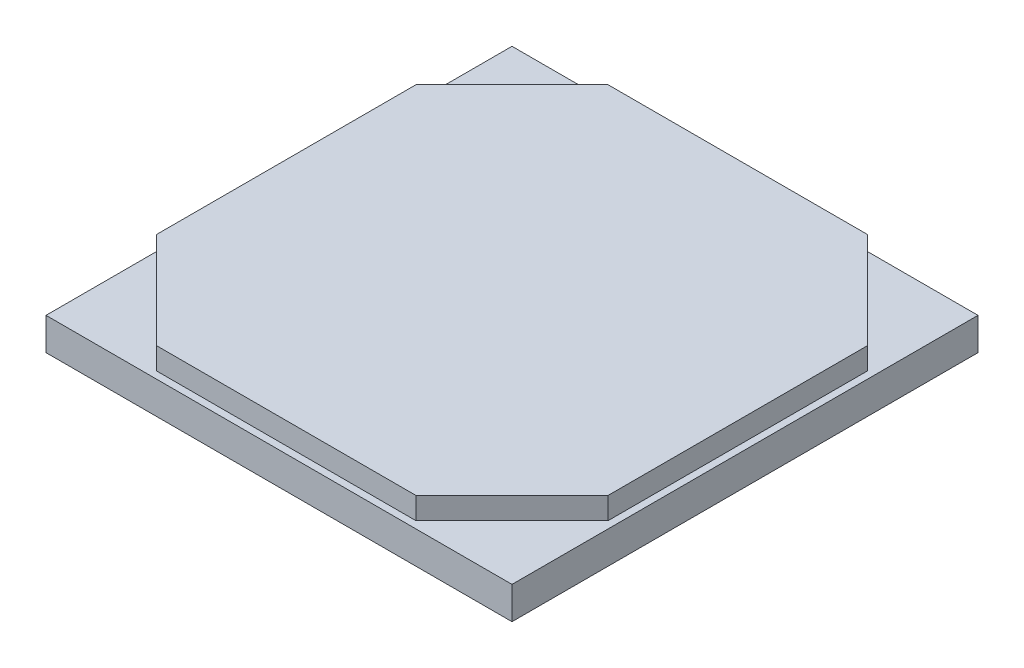
ISO-10303-21;
HEADER;
FILE_DESCRIPTION(('STEP AP214'),'2;1');
FILE_NAME('part.step','',(''),(''),'','','');
FILE_SCHEMA(('AUTOMOTIVE_DESIGN { 1 0 10303 214 1 1 1 1 }'));
ENDSEC;
DATA;
#1=APPLICATION_CONTEXT('core data for automotive mechanical design processes');
#2=APPLICATION_PROTOCOL_DEFINITION('international standard','automotive_design',2000,#1);
#3=PRODUCT_CONTEXT('',#1,'mechanical');
#4=PRODUCT('Part','Part','',(#3));
#5=PRODUCT_RELATED_PRODUCT_CATEGORY('part','',(#4));
#6=PRODUCT_DEFINITION_FORMATION('','',#4);
#7=PRODUCT_DEFINITION_CONTEXT('part definition',#1,'design');
#8=PRODUCT_DEFINITION('design','',#6,#7);
#9=PRODUCT_DEFINITION_SHAPE('','',#8);
#10=(LENGTH_UNIT() NAMED_UNIT(*) SI_UNIT(.MILLI.,.METRE.));
#11=(NAMED_UNIT(*) PLANE_ANGLE_UNIT() SI_UNIT($,.RADIAN.));
#12=(NAMED_UNIT(*) SI_UNIT($,.STERADIAN.) SOLID_ANGLE_UNIT());
#13=UNCERTAINTY_MEASURE_WITH_UNIT(LENGTH_MEASURE(1.E-05),#10,'distance_accuracy_value','');
#14=(GEOMETRIC_REPRESENTATION_CONTEXT(3) GLOBAL_UNCERTAINTY_ASSIGNED_CONTEXT((#13)) GLOBAL_UNIT_ASSIGNED_CONTEXT((#10,
#11,#12)) REPRESENTATION_CONTEXT('',''));
#15=CARTESIAN_POINT('',(0.,0.,0.));
#16=DIRECTION('',(0.,0.,1.));
#17=DIRECTION('',(1.,0.,0.));
#18=AXIS2_PLACEMENT_3D('',#15,#16,#17);
#19=CARTESIAN_POINT('',(9.8,0.85364793020948,7.29742688815748));
#20=DIRECTION('',(0.,-1.,0.));
#21=DIRECTION('',(0.,0.,-1.));
#22=AXIS2_PLACEMENT_3D('',#19,#20,#21);
#23=PLANE('',#22);
#24=DIRECTION('',(0.,0.,1.));
#25=VECTOR('',#24,1.);
#26=CARTESIAN_POINT('',(0.,0.85364793020948,7.29742688815748));
#27=LINE('',#26,#25);
#28=CARTESIAN_POINT('',(0.,0.85364793020948,-2.50257311184252));
#29=VERTEX_POINT('',#28);
#30=CARTESIAN_POINT('',(0.,0.85364793020948,7.29742688815748));
#31=VERTEX_POINT('',#30);
#32=EDGE_CURVE('E82',#29,#31,#27,.T.);
#33=ORIENTED_EDGE('',*,*,#32,.T.);
#34=DIRECTION('',(-1.,0.,0.));
#35=VECTOR('',#34,1.);
#36=CARTESIAN_POINT('',(9.8,0.85364793020948,7.29742688815748));
#37=LINE('',#36,#35);
#38=CARTESIAN_POINT('',(9.8,0.85364793020948,7.29742688815748));
#39=VERTEX_POINT('',#38);
#40=EDGE_CURVE('E174',#39,#31,#37,.T.);
#41=ORIENTED_EDGE('',*,*,#40,.F.);
#42=DIRECTION('',(0.,0.,1.));
#43=VECTOR('',#42,1.);
#44=CARTESIAN_POINT('',(9.8,0.85364793020948,7.29742688815748));
#45=LINE('',#44,#43);
#46=CARTESIAN_POINT('',(9.8,0.85364793020948,-2.50257311184252));
#47=VERTEX_POINT('',#46);
#48=EDGE_CURVE('E61',#47,#39,#45,.T.);
#49=ORIENTED_EDGE('',*,*,#48,.F.);
#50=DIRECTION('',(-1.,0.,0.));
#51=VECTOR('',#50,1.);
#52=CARTESIAN_POINT('',(9.8,0.85364793020948,-2.50257311184252));
#53=LINE('',#52,#51);
#54=EDGE_CURVE('E181',#47,#29,#53,.T.);
#55=ORIENTED_EDGE('',*,*,#54,.T.);
#56=EDGE_LOOP('',(#33,#41,#49,#55));
#57=FACE_BOUND('',#56,.T.);
#58=DIRECTION('',(-0.707106781186541,0.,0.707106781186554));
#59=VECTOR('',#58,1.);
#60=CARTESIAN_POINT('',(-0.0912865559212405,0.85364793020948,-0.0912865559212388));
#61=LINE('',#60,#59);
#62=CARTESIAN_POINT('',(2.17,0.85364793020948,-2.35257311184252));
#63=VERTEX_POINT('',#62);
#64=CARTESIAN_POINT('',(0.15,0.85364793020948,-0.332573111842484));
#65=VERTEX_POINT('',#64);
#66=EDGE_CURVE('E158',#63,#65,#61,.T.);
#67=ORIENTED_EDGE('',*,*,#66,.F.);
#68=DIRECTION('',(1.,0.,0.));
#69=VECTOR('',#68,1.);
#70=CARTESIAN_POINT('',(0.,0.85364793020948,-2.35257311184252));
#71=LINE('',#70,#69);
#72=CARTESIAN_POINT('',(7.63,0.85364793020948,-2.35257311184252));
#73=VERTEX_POINT('',#72);
#74=EDGE_CURVE('E154',#63,#73,#71,.T.);
#75=ORIENTED_EDGE('',*,*,#74,.T.);
#76=DIRECTION('',(0.707106781186548,0.,0.707106781186548));
#77=VECTOR('',#76,1.);
#78=CARTESIAN_POINT('',(4.99128655592126,0.85364793020948,-4.99128655592126));
#79=LINE('',#78,#77);
#80=CARTESIAN_POINT('',(9.65,0.85364793020948,-0.332573111842523));
#81=VERTEX_POINT('',#80);
#82=EDGE_CURVE('E52',#73,#81,#79,.T.);
#83=ORIENTED_EDGE('',*,*,#82,.T.);
#84=DIRECTION('',(0.,0.,1.));
#85=VECTOR('',#84,1.);
#86=CARTESIAN_POINT('',(9.65,0.85364793020948,0.));
#87=LINE('',#86,#85);
#88=CARTESIAN_POINT('',(9.65,0.85364793020948,5.12742688815748));
#89=VERTEX_POINT('',#88);
#90=EDGE_CURVE('E214',#81,#89,#87,.T.);
#91=ORIENTED_EDGE('',*,*,#90,.T.);
#92=DIRECTION('',(-0.707106781186548,0.,0.707106781186548));
#93=VECTOR('',#92,1.);
#94=CARTESIAN_POINT('',(7.38871344407874,0.85364793020948,7.38871344407874));
#95=LINE('',#94,#93);
#96=CARTESIAN_POINT('',(7.63,0.85364793020948,7.14742688815748));
#97=VERTEX_POINT('',#96);
#98=EDGE_CURVE('E211',#89,#97,#95,.T.);
#99=ORIENTED_EDGE('',*,*,#98,.T.);
#100=DIRECTION('',(1.,0.,0.));
#101=VECTOR('',#100,1.);
#102=CARTESIAN_POINT('',(0.,0.85364793020948,7.14742688815748));
#103=LINE('',#102,#101);
#104=CARTESIAN_POINT('',(2.17,0.85364793020948,7.14742688815748));
#105=VERTEX_POINT('',#104);
#106=EDGE_CURVE('E208',#105,#97,#103,.T.);
#107=ORIENTED_EDGE('',*,*,#106,.F.);
#108=DIRECTION('',(0.707106781186548,0.,0.707106781186548));
#109=VECTOR('',#108,1.);
#110=CARTESIAN_POINT('',(-2.48871344407874,0.85364793020948,2.48871344407874));
#111=LINE('',#110,#109);
#112=CARTESIAN_POINT('',(0.150000000000001,0.85364793020948,5.12742688815748));
#113=VERTEX_POINT('',#112);
#114=EDGE_CURVE('E202',#113,#105,#111,.T.);
#115=ORIENTED_EDGE('',*,*,#114,.F.);
#116=DIRECTION('',(0.,0.,1.));
#117=VECTOR('',#116,1.);
#118=CARTESIAN_POINT('',(0.15,0.85364793020948,0.));
#119=LINE('',#118,#117);
#120=EDGE_CURVE('E200',#65,#113,#119,.T.);
#121=ORIENTED_EDGE('',*,*,#120,.F.);
#122=EDGE_LOOP('',(#67,#75,#83,#91,#99,#107,#115,#121));
#123=FACE_BOUND('',#122,.T.);
#124=ADVANCED_FACE('F37',(#57,#123),#23,.F.);
#125=CARTESIAN_POINT('',(9.8,0.85364793020948,7.29742688815748));
#126=DIRECTION('',(0.,0.,-1.));
#127=DIRECTION('',(-1.,0.,0.));
#128=AXIS2_PLACEMENT_3D('',#125,#126,#127);
#129=PLANE('',#128);
#130=DIRECTION('',(0.,-1.,0.));
#131=VECTOR('',#130,1.);
#132=CARTESIAN_POINT('',(0.,0.85364793020948,7.29742688815748));
#133=LINE('',#132,#131);
#134=CARTESIAN_POINT('',(0.,0.17364793020948,7.29742688815748));
#135=VERTEX_POINT('',#134);
#136=EDGE_CURVE('E160',#31,#135,#133,.T.);
#137=ORIENTED_EDGE('',*,*,#136,.T.);
#138=DIRECTION('',(-1.,0.,0.));
#139=VECTOR('',#138,1.);
#140=CARTESIAN_POINT('',(9.8,0.17364793020948,7.29742688815748));
#141=LINE('',#140,#139);
#142=CARTESIAN_POINT('',(9.8,0.17364793020948,7.29742688815748));
#143=VERTEX_POINT('',#142);
#144=EDGE_CURVE('E11',#143,#135,#141,.T.);
#145=ORIENTED_EDGE('',*,*,#144,.F.);
#146=DIRECTION('',(0.,-1.,0.));
#147=VECTOR('',#146,1.);
#148=CARTESIAN_POINT('',(9.8,0.85364793020948,7.29742688815748));
#149=LINE('',#148,#147);
#150=EDGE_CURVE('E169',#39,#143,#149,.T.);
#151=ORIENTED_EDGE('',*,*,#150,.F.);
#152=ORIENTED_EDGE('',*,*,#40,.T.);
#153=EDGE_LOOP('',(#137,#145,#151,#152));
#154=FACE_BOUND('',#153,.T.);
#155=ADVANCED_FACE('F39',(#154),#129,.F.);
#156=CARTESIAN_POINT('',(9.8,0.17364793020948,7.29742688815748));
#157=DIRECTION('',(0.,1.,0.));
#158=DIRECTION('',(0.,0.,1.));
#159=AXIS2_PLACEMENT_3D('',#156,#157,#158);
#160=PLANE('',#159);
#161=DIRECTION('',(0.,0.,-1.));
#162=VECTOR('',#161,1.);
#163=CARTESIAN_POINT('',(0.,0.17364793020948,7.29742688815748));
#164=LINE('',#163,#162);
#165=CARTESIAN_POINT('',(0.,0.17364793020948,-2.50257311184252));
#166=VERTEX_POINT('',#165);
#167=EDGE_CURVE('E163',#135,#166,#164,.T.);
#168=ORIENTED_EDGE('',*,*,#167,.T.);
#169=DIRECTION('',(-1.,0.,0.));
#170=VECTOR('',#169,1.);
#171=CARTESIAN_POINT('',(9.8,0.17364793020948,-2.50257311184252));
#172=LINE('',#171,#170);
#173=CARTESIAN_POINT('',(9.8,0.17364793020948,-2.50257311184252));
#174=VERTEX_POINT('',#173);
#175=EDGE_CURVE('E45',#174,#166,#172,.T.);
#176=ORIENTED_EDGE('',*,*,#175,.F.);
#177=DIRECTION('',(0.,0.,-1.));
#178=VECTOR('',#177,1.);
#179=CARTESIAN_POINT('',(9.8,0.17364793020948,7.29742688815748));
#180=LINE('',#179,#178);
#181=EDGE_CURVE('E89',#143,#174,#180,.T.);
#182=ORIENTED_EDGE('',*,*,#181,.F.);
#183=ORIENTED_EDGE('',*,*,#144,.T.);
#184=EDGE_LOOP('',(#168,#176,#182,#183));
#185=FACE_BOUND('',#184,.T.);
#186=ADVANCED_FACE('F283',(#185),#160,.F.);
#187=CARTESIAN_POINT('',(9.8,0.85364793020948,-2.50257311184252));
#188=DIRECTION('',(0.,0.,1.));
#189=DIRECTION('',(0.,-1.,0.));
#190=AXIS2_PLACEMENT_3D('',#187,#188,#189);
#191=PLANE('',#190);
#192=DIRECTION('',(0.,1.,0.));
#193=VECTOR('',#192,1.);
#194=CARTESIAN_POINT('',(0.,0.85364793020948,-2.50257311184252));
#195=LINE('',#194,#193);
#196=EDGE_CURVE('E177',#166,#29,#195,.T.);
#197=ORIENTED_EDGE('',*,*,#196,.T.);
#198=ORIENTED_EDGE('',*,*,#54,.F.);
#199=DIRECTION('',(0.,1.,0.));
#200=VECTOR('',#199,1.);
#201=CARTESIAN_POINT('',(9.8,0.85364793020948,-2.50257311184252));
#202=LINE('',#201,#200);
#203=EDGE_CURVE('E172',#174,#47,#202,.T.);
#204=ORIENTED_EDGE('',*,*,#203,.F.);
#205=ORIENTED_EDGE('',*,*,#175,.T.);
#206=EDGE_LOOP('',(#197,#198,#204,#205));
#207=FACE_BOUND('',#206,.T.);
#208=ADVANCED_FACE('F186',(#207),#191,.F.);
#209=CARTESIAN_POINT('',(9.8,0.,0.));
#210=DIRECTION('',(1.,0.,0.));
#211=DIRECTION('',(0.,0.,-1.));
#212=AXIS2_PLACEMENT_3D('',#209,#210,#211);
#213=PLANE('',#212);
#214=ORIENTED_EDGE('',*,*,#150,.T.);
#215=ORIENTED_EDGE('',*,*,#181,.T.);
#216=ORIENTED_EDGE('',*,*,#203,.T.);
#217=ORIENTED_EDGE('',*,*,#48,.T.);
#218=EDGE_LOOP('',(#214,#215,#216,#217));
#219=FACE_BOUND('',#218,.T.);
#220=ADVANCED_FACE('F277',(#219),#213,.T.);
#221=CARTESIAN_POINT('',(0.,0.,0.));
#222=DIRECTION('',(1.,0.,0.));
#223=DIRECTION('',(0.,0.,-1.));
#224=AXIS2_PLACEMENT_3D('',#221,#222,#223);
#225=PLANE('',#224);
#226=ORIENTED_EDGE('',*,*,#136,.F.);
#227=ORIENTED_EDGE('',*,*,#32,.F.);
#228=ORIENTED_EDGE('',*,*,#196,.F.);
#229=ORIENTED_EDGE('',*,*,#167,.F.);
#230=EDGE_LOOP('',(#226,#227,#228,#229));
#231=FACE_BOUND('',#230,.T.);
#232=ADVANCED_FACE('F190',(#231),#225,.F.);
#233=CARTESIAN_POINT('',(-0.0912865559212405,1.31364793020948,-0.0912865559212388));
#234=DIRECTION('',(0.707106781186554,0.,0.707106781186541));
#235=DIRECTION('',(0.707106781186541,0.,-0.707106781186554));
#236=AXIS2_PLACEMENT_3D('',#233,#234,#235);
#237=PLANE('',#236);
#238=ORIENTED_EDGE('',*,*,#66,.T.);
#239=DIRECTION('',(0.,-1.,0.));
#240=VECTOR('',#239,1.);
#241=CARTESIAN_POINT('',(0.15,1.31364793020948,-0.332573111842484));
#242=LINE('',#241,#240);
#243=CARTESIAN_POINT('',(0.15,1.31364793020948,-0.332573111842484));
#244=VERTEX_POINT('',#243);
#245=EDGE_CURVE('E138',#244,#65,#242,.T.);
#246=ORIENTED_EDGE('',*,*,#245,.F.);
#247=DIRECTION('',(-0.707106781186541,0.,0.707106781186554));
#248=VECTOR('',#247,1.);
#249=CARTESIAN_POINT('',(-0.0912865559212405,1.31364793020948,-0.0912865559212388));
#250=LINE('',#249,#248);
#251=CARTESIAN_POINT('',(2.17,1.31364793020948,-2.35257311184252));
#252=VERTEX_POINT('',#251);
#253=EDGE_CURVE('E145',#252,#244,#250,.T.);
#254=ORIENTED_EDGE('',*,*,#253,.F.);
#255=DIRECTION('',(0.,-1.,0.));
#256=VECTOR('',#255,1.);
#257=CARTESIAN_POINT('',(2.17,1.31364793020948,-2.35257311184252));
#258=LINE('',#257,#256);
#259=EDGE_CURVE('E219',#252,#63,#258,.T.);
#260=ORIENTED_EDGE('',*,*,#259,.T.);
#261=EDGE_LOOP('',(#238,#246,#254,#260));
#262=FACE_BOUND('',#261,.T.);
#263=ADVANCED_FACE('F156',(#262),#237,.F.);
#264=CARTESIAN_POINT('',(0.15,1.31364793020948,0.));
#265=DIRECTION('',(1.,0.,0.));
#266=DIRECTION('',(0.,0.,-1.));
#267=AXIS2_PLACEMENT_3D('',#264,#265,#266);
#268=PLANE('',#267);
#269=ORIENTED_EDGE('',*,*,#120,.T.);
#270=DIRECTION('',(0.,-1.,0.));
#271=VECTOR('',#270,1.);
#272=CARTESIAN_POINT('',(0.150000000000001,1.31364793020948,5.12742688815748));
#273=LINE('',#272,#271);
#274=CARTESIAN_POINT('',(0.150000000000001,1.31364793020948,5.12742688815748));
#275=VERTEX_POINT('',#274);
#276=EDGE_CURVE('E141',#275,#113,#273,.T.);
#277=ORIENTED_EDGE('',*,*,#276,.F.);
#278=DIRECTION('',(0.,0.,1.));
#279=VECTOR('',#278,1.);
#280=CARTESIAN_POINT('',(0.15,1.31364793020948,0.));
#281=LINE('',#280,#279);
#282=EDGE_CURVE('E134',#244,#275,#281,.T.);
#283=ORIENTED_EDGE('',*,*,#282,.F.);
#284=ORIENTED_EDGE('',*,*,#245,.T.);
#285=EDGE_LOOP('',(#269,#277,#283,#284));
#286=FACE_BOUND('',#285,.T.);
#287=ADVANCED_FACE('F136',(#286),#268,.F.);
#288=CARTESIAN_POINT('',(-2.48871344407874,1.31364793020948,2.48871344407874));
#289=DIRECTION('',(0.707106781186548,0.,-0.707106781186548));
#290=DIRECTION('',(-0.707106781186548,0.,-0.707106781186548));
#291=AXIS2_PLACEMENT_3D('',#288,#289,#290);
#292=PLANE('',#291);
#293=ORIENTED_EDGE('',*,*,#114,.T.);
#294=DIRECTION('',(0.,-1.,0.));
#295=VECTOR('',#294,1.);
#296=CARTESIAN_POINT('',(2.17,1.31364793020948,7.14742688815748));
#297=LINE('',#296,#295);
#298=CARTESIAN_POINT('',(2.17,1.31364793020948,7.14742688815748));
#299=VERTEX_POINT('',#298);
#300=EDGE_CURVE('E165',#299,#105,#297,.T.);
#301=ORIENTED_EDGE('',*,*,#300,.F.);
#302=DIRECTION('',(0.707106781186548,0.,0.707106781186548));
#303=VECTOR('',#302,1.);
#304=CARTESIAN_POINT('',(-2.48871344407874,1.31364793020948,2.48871344407874));
#305=LINE('',#304,#303);
#306=EDGE_CURVE('E144',#275,#299,#305,.T.);
#307=ORIENTED_EDGE('',*,*,#306,.F.);
#308=ORIENTED_EDGE('',*,*,#276,.T.);
#309=EDGE_LOOP('',(#293,#301,#307,#308));
#310=FACE_BOUND('',#309,.T.);
#311=ADVANCED_FACE('F270',(#310),#292,.F.);
#312=CARTESIAN_POINT('',(0.,1.31364793020948,7.14742688815748));
#313=DIRECTION('',(0.,0.,-1.));
#314=DIRECTION('',(-1.,0.,0.));
#315=AXIS2_PLACEMENT_3D('',#312,#313,#314);
#316=PLANE('',#315);
#317=ORIENTED_EDGE('',*,*,#106,.T.);
#318=DIRECTION('',(0.,-1.,0.));
#319=VECTOR('',#318,1.);
#320=CARTESIAN_POINT('',(7.63,1.31364793020948,7.14742688815748));
#321=LINE('',#320,#319);
#322=CARTESIAN_POINT('',(7.63,1.31364793020948,7.14742688815748));
#323=VERTEX_POINT('',#322);
#324=EDGE_CURVE('E227',#323,#97,#321,.T.);
#325=ORIENTED_EDGE('',*,*,#324,.F.);
#326=DIRECTION('',(1.,0.,0.));
#327=VECTOR('',#326,1.);
#328=CARTESIAN_POINT('',(0.,1.31364793020948,7.14742688815748));
#329=LINE('',#328,#327);
#330=EDGE_CURVE('E235',#299,#323,#329,.T.);
#331=ORIENTED_EDGE('',*,*,#330,.F.);
#332=ORIENTED_EDGE('',*,*,#300,.T.);
#333=EDGE_LOOP('',(#317,#325,#331,#332));
#334=FACE_BOUND('',#333,.T.);
#335=ADVANCED_FACE('F233',(#334),#316,.F.);
#336=CARTESIAN_POINT('',(7.38871344407874,1.31364793020948,7.38871344407874));
#337=DIRECTION('',(0.707106781186548,0.,0.707106781186548));
#338=DIRECTION('',(0.707106781186548,0.,-0.707106781186548));
#339=AXIS2_PLACEMENT_3D('',#336,#337,#338);
#340=PLANE('',#339);
#341=ORIENTED_EDGE('',*,*,#98,.F.);
#342=DIRECTION('',(0.,-1.,0.));
#343=VECTOR('',#342,1.);
#344=CARTESIAN_POINT('',(9.65,1.31364793020948,5.12742688815748));
#345=LINE('',#344,#343);
#346=CARTESIAN_POINT('',(9.65,1.31364793020948,5.12742688815748));
#347=VERTEX_POINT('',#346);
#348=EDGE_CURVE('E225',#347,#89,#345,.T.);
#349=ORIENTED_EDGE('',*,*,#348,.F.);
#350=DIRECTION('',(-0.707106781186548,0.,0.707106781186548));
#351=VECTOR('',#350,1.);
#352=CARTESIAN_POINT('',(7.38871344407874,1.31364793020948,7.38871344407874));
#353=LINE('',#352,#351);
#354=EDGE_CURVE('E243',#347,#323,#353,.T.);
#355=ORIENTED_EDGE('',*,*,#354,.T.);
#356=ORIENTED_EDGE('',*,*,#324,.T.);
#357=EDGE_LOOP('',(#341,#349,#355,#356));
#358=FACE_BOUND('',#357,.T.);
#359=ADVANCED_FACE('F240',(#358),#340,.T.);
#360=CARTESIAN_POINT('',(9.65,1.31364793020948,0.));
#361=DIRECTION('',(1.,0.,0.));
#362=DIRECTION('',(0.,0.,-1.));
#363=AXIS2_PLACEMENT_3D('',#360,#361,#362);
#364=PLANE('',#363);
#365=ORIENTED_EDGE('',*,*,#90,.F.);
#366=DIRECTION('',(0.,-1.,0.));
#367=VECTOR('',#366,1.);
#368=CARTESIAN_POINT('',(9.65,1.31364793020948,-0.332573111842523));
#369=LINE('',#368,#367);
#370=CARTESIAN_POINT('',(9.65,1.31364793020948,-0.332573111842523));
#371=VERTEX_POINT('',#370);
#372=EDGE_CURVE('E223',#371,#81,#369,.T.);
#373=ORIENTED_EDGE('',*,*,#372,.F.);
#374=DIRECTION('',(0.,0.,1.));
#375=VECTOR('',#374,1.);
#376=CARTESIAN_POINT('',(9.65,1.31364793020948,0.));
#377=LINE('',#376,#375);
#378=EDGE_CURVE('E246',#371,#347,#377,.T.);
#379=ORIENTED_EDGE('',*,*,#378,.T.);
#380=ORIENTED_EDGE('',*,*,#348,.T.);
#381=EDGE_LOOP('',(#365,#373,#379,#380));
#382=FACE_BOUND('',#381,.T.);
#383=ADVANCED_FACE('F257',(#382),#364,.T.);
#384=CARTESIAN_POINT('',(4.99128655592126,1.31364793020948,-4.99128655592126));
#385=DIRECTION('',(0.707106781186548,0.,-0.707106781186548));
#386=DIRECTION('',(-0.707106781186548,0.,-0.707106781186548));
#387=AXIS2_PLACEMENT_3D('',#384,#385,#386);
#388=PLANE('',#387);
#389=ORIENTED_EDGE('',*,*,#82,.F.);
#390=DIRECTION('',(0.,-1.,0.));
#391=VECTOR('',#390,1.);
#392=CARTESIAN_POINT('',(7.63,1.31364793020948,-2.35257311184252));
#393=LINE('',#392,#391);
#394=CARTESIAN_POINT('',(7.63,1.31364793020948,-2.35257311184252));
#395=VERTEX_POINT('',#394);
#396=EDGE_CURVE('E221',#395,#73,#393,.T.);
#397=ORIENTED_EDGE('',*,*,#396,.F.);
#398=DIRECTION('',(0.707106781186548,0.,0.707106781186548));
#399=VECTOR('',#398,1.);
#400=CARTESIAN_POINT('',(4.99128655592126,1.31364793020948,-4.99128655592126));
#401=LINE('',#400,#399);
#402=EDGE_CURVE('E248',#395,#371,#401,.T.);
#403=ORIENTED_EDGE('',*,*,#402,.T.);
#404=ORIENTED_EDGE('',*,*,#372,.T.);
#405=EDGE_LOOP('',(#389,#397,#403,#404));
#406=FACE_BOUND('',#405,.T.);
#407=ADVANCED_FACE('F255',(#406),#388,.T.);
#408=CARTESIAN_POINT('',(0.,1.31364793020948,-2.35257311184252));
#409=DIRECTION('',(0.,0.,-1.));
#410=DIRECTION('',(-1.,0.,0.));
#411=AXIS2_PLACEMENT_3D('',#408,#409,#410);
#412=PLANE('',#411);
#413=ORIENTED_EDGE('',*,*,#74,.F.);
#414=ORIENTED_EDGE('',*,*,#259,.F.);
#415=DIRECTION('',(1.,0.,0.));
#416=VECTOR('',#415,1.);
#417=CARTESIAN_POINT('',(0.,1.31364793020948,-2.35257311184252));
#418=LINE('',#417,#416);
#419=EDGE_CURVE('E152',#252,#395,#418,.T.);
#420=ORIENTED_EDGE('',*,*,#419,.T.);
#421=ORIENTED_EDGE('',*,*,#396,.T.);
#422=EDGE_LOOP('',(#413,#414,#420,#421));
#423=FACE_BOUND('',#422,.T.);
#424=ADVANCED_FACE('F254',(#423),#412,.T.);
#425=CARTESIAN_POINT('',(0.,1.31364793020948,0.));
#426=DIRECTION('',(0.,1.,0.));
#427=DIRECTION('',(0.,0.,1.));
#428=AXIS2_PLACEMENT_3D('',#425,#426,#427);
#429=PLANE('',#428);
#430=ORIENTED_EDGE('',*,*,#253,.T.);
#431=ORIENTED_EDGE('',*,*,#282,.T.);
#432=ORIENTED_EDGE('',*,*,#306,.T.);
#433=ORIENTED_EDGE('',*,*,#330,.T.);
#434=ORIENTED_EDGE('',*,*,#354,.F.);
#435=ORIENTED_EDGE('',*,*,#378,.F.);
#436=ORIENTED_EDGE('',*,*,#402,.F.);
#437=ORIENTED_EDGE('',*,*,#419,.F.);
#438=EDGE_LOOP('',(#430,#431,#432,#433,#434,#435,#436,#437));
#439=FACE_BOUND('',#438,.T.);
#440=ADVANCED_FACE('F149',(#439),#429,.T.);
#441=CLOSED_SHELL('',(#124,#155,#186,#208,#220,#232,#263,#287,#311,#335,#359,#383,#407,#424,#440));
#442=MANIFOLD_SOLID_BREP('B2',#441);
#443=ADVANCED_BREP_SHAPE_REPRESENTATION('',(#18,#442),#14);
#444=SHAPE_DEFINITION_REPRESENTATION(#9,#443);
ENDSEC;
END-ISO-10303-21;
